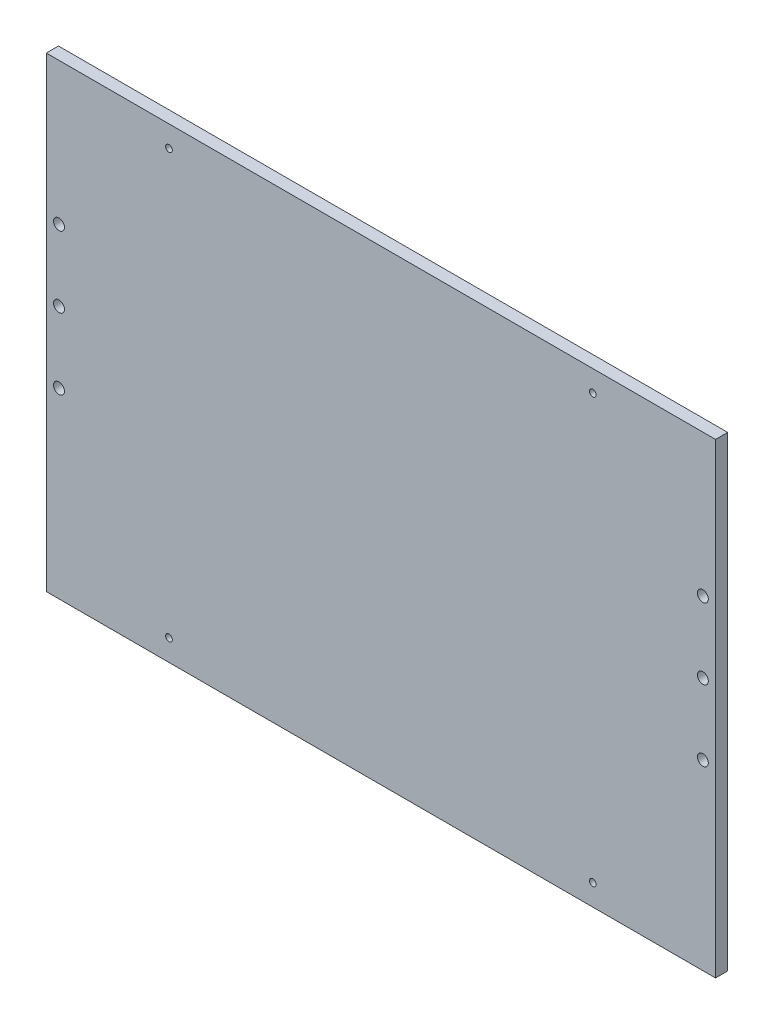
ISO-10303-21;
HEADER;
FILE_DESCRIPTION(('STEP AP214'),'2;1');
FILE_NAME('part.step','',(''),(''),'','','');
FILE_SCHEMA(('AUTOMOTIVE_DESIGN { 1 0 10303 214 1 1 1 1 }'));
ENDSEC;
DATA;
#1=APPLICATION_CONTEXT('core data for automotive mechanical design processes');
#2=APPLICATION_PROTOCOL_DEFINITION('international standard','automotive_design',2000,#1);
#3=PRODUCT_CONTEXT('',#1,'mechanical');
#4=PRODUCT('Part','Part','',(#3));
#5=PRODUCT_RELATED_PRODUCT_CATEGORY('part','',(#4));
#6=PRODUCT_DEFINITION_FORMATION('','',#4);
#7=PRODUCT_DEFINITION_CONTEXT('part definition',#1,'design');
#8=PRODUCT_DEFINITION('design','',#6,#7);
#9=PRODUCT_DEFINITION_SHAPE('','',#8);
#10=(LENGTH_UNIT() NAMED_UNIT(*) SI_UNIT(.MILLI.,.METRE.));
#11=(NAMED_UNIT(*) PLANE_ANGLE_UNIT() SI_UNIT($,.RADIAN.));
#12=(NAMED_UNIT(*) SI_UNIT($,.STERADIAN.) SOLID_ANGLE_UNIT());
#13=UNCERTAINTY_MEASURE_WITH_UNIT(LENGTH_MEASURE(1.E-05),#10,'distance_accuracy_value','');
#14=(GEOMETRIC_REPRESENTATION_CONTEXT(3) GLOBAL_UNCERTAINTY_ASSIGNED_CONTEXT((#13)) GLOBAL_UNIT_ASSIGNED_CONTEXT((#10,
#11,#12)) REPRESENTATION_CONTEXT('',''));
#15=CARTESIAN_POINT('',(0.,0.,0.));
#16=DIRECTION('',(0.,0.,1.));
#17=DIRECTION('',(1.,0.,0.));
#18=AXIS2_PLACEMENT_3D('',#15,#16,#17);
#19=CARTESIAN_POINT('',(-165.,-80.,72.));
#20=DIRECTION('',(-1.,0.,0.));
#21=DIRECTION('',(0.,-1.,0.));
#22=AXIS2_PLACEMENT_3D('',#19,#20,#21);
#23=PLANE('',#22);
#24=DIRECTION('',(0.,1.,0.));
#25=VECTOR('',#24,1.);
#26=CARTESIAN_POINT('',(-165.,-80.,66.));
#27=LINE('',#26,#25);
#28=CARTESIAN_POINT('',(-165.,-195.,66.));
#29=VERTEX_POINT('',#28);
#30=CARTESIAN_POINT('',(-165.,35.,66.));
#31=VERTEX_POINT('',#30);
#32=EDGE_CURVE('E104',#29,#31,#27,.T.);
#33=ORIENTED_EDGE('',*,*,#32,.F.);
#34=DIRECTION('',(0.,0.,-1.));
#35=VECTOR('',#34,1.);
#36=CARTESIAN_POINT('',(-165.,-195.,72.));
#37=LINE('',#36,#35);
#38=CARTESIAN_POINT('',(-165.,-195.,72.));
#39=VERTEX_POINT('',#38);
#40=EDGE_CURVE('E10',#39,#29,#37,.T.);
#41=ORIENTED_EDGE('',*,*,#40,.F.);
#42=DIRECTION('',(0.,1.,0.));
#43=VECTOR('',#42,1.);
#44=CARTESIAN_POINT('',(-165.,-80.,72.));
#45=LINE('',#44,#43);
#46=CARTESIAN_POINT('',(-165.,35.,72.));
#47=VERTEX_POINT('',#46);
#48=EDGE_CURVE('E81',#39,#47,#45,.T.);
#49=ORIENTED_EDGE('',*,*,#48,.T.);
#50=DIRECTION('',(0.,0.,-1.));
#51=VECTOR('',#50,1.);
#52=CARTESIAN_POINT('',(-165.,35.,72.));
#53=LINE('',#52,#51);
#54=EDGE_CURVE('E40',#47,#31,#53,.T.);
#55=ORIENTED_EDGE('',*,*,#54,.T.);
#56=EDGE_LOOP('',(#33,#41,#49,#55));
#57=FACE_BOUND('',#56,.T.);
#58=ADVANCED_FACE('F16',(#57),#23,.T.);
#59=CARTESIAN_POINT('',(0.,-195.,72.));
#60=DIRECTION('',(0.,1.,0.));
#61=DIRECTION('',(0.,0.,1.));
#62=AXIS2_PLACEMENT_3D('',#59,#60,#61);
#63=PLANE('',#62);
#64=DIRECTION('',(1.,0.,0.));
#65=VECTOR('',#64,1.);
#66=CARTESIAN_POINT('',(0.,-195.,66.));
#67=LINE('',#66,#65);
#68=CARTESIAN_POINT('',(165.,-195.,66.));
#69=VERTEX_POINT('',#68);
#70=EDGE_CURVE('E88',#29,#69,#67,.T.);
#71=ORIENTED_EDGE('',*,*,#70,.T.);
#72=DIRECTION('',(0.,0.,-1.));
#73=VECTOR('',#72,1.);
#74=CARTESIAN_POINT('',(165.,-195.,72.));
#75=LINE('',#74,#73);
#76=CARTESIAN_POINT('',(165.,-195.,72.));
#77=VERTEX_POINT('',#76);
#78=EDGE_CURVE('E26',#77,#69,#75,.T.);
#79=ORIENTED_EDGE('',*,*,#78,.F.);
#80=DIRECTION('',(1.,0.,0.));
#81=VECTOR('',#80,1.);
#82=CARTESIAN_POINT('',(0.,-195.,72.));
#83=LINE('',#82,#81);
#84=EDGE_CURVE('E75',#39,#77,#83,.T.);
#85=ORIENTED_EDGE('',*,*,#84,.F.);
#86=ORIENTED_EDGE('',*,*,#40,.T.);
#87=EDGE_LOOP('',(#71,#79,#85,#86));
#88=FACE_BOUND('',#87,.T.);
#89=ADVANCED_FACE('F86',(#88),#63,.F.);
#90=CARTESIAN_POINT('',(165.,-80.,72.));
#91=DIRECTION('',(-1.,0.,0.));
#92=DIRECTION('',(0.,-1.,0.));
#93=AXIS2_PLACEMENT_3D('',#90,#91,#92);
#94=PLANE('',#93);
#95=DIRECTION('',(0.,1.,0.));
#96=VECTOR('',#95,1.);
#97=CARTESIAN_POINT('',(165.,-80.,66.));
#98=LINE('',#97,#96);
#99=CARTESIAN_POINT('',(165.,35.,66.));
#100=VERTEX_POINT('',#99);
#101=EDGE_CURVE('E109',#69,#100,#98,.T.);
#102=ORIENTED_EDGE('',*,*,#101,.T.);
#103=DIRECTION('',(0.,0.,-1.));
#104=VECTOR('',#103,1.);
#105=CARTESIAN_POINT('',(165.,35.,72.));
#106=LINE('',#105,#104);
#107=CARTESIAN_POINT('',(165.,35.,72.));
#108=VERTEX_POINT('',#107);
#109=EDGE_CURVE('E58',#108,#100,#106,.T.);
#110=ORIENTED_EDGE('',*,*,#109,.F.);
#111=DIRECTION('',(0.,1.,0.));
#112=VECTOR('',#111,1.);
#113=CARTESIAN_POINT('',(165.,-80.,72.));
#114=LINE('',#113,#112);
#115=EDGE_CURVE('E80',#77,#108,#114,.T.);
#116=ORIENTED_EDGE('',*,*,#115,.F.);
#117=ORIENTED_EDGE('',*,*,#78,.T.);
#118=EDGE_LOOP('',(#102,#110,#116,#117));
#119=FACE_BOUND('',#118,.T.);
#120=ADVANCED_FACE('F93',(#119),#94,.F.);
#121=CARTESIAN_POINT('',(0.,35.,72.));
#122=DIRECTION('',(0.,1.,0.));
#123=DIRECTION('',(0.,0.,1.));
#124=AXIS2_PLACEMENT_3D('',#121,#122,#123);
#125=PLANE('',#124);
#126=DIRECTION('',(1.,0.,0.));
#127=VECTOR('',#126,1.);
#128=CARTESIAN_POINT('',(0.,35.,66.));
#129=LINE('',#128,#127);
#130=EDGE_CURVE('E111',#31,#100,#129,.T.);
#131=ORIENTED_EDGE('',*,*,#130,.F.);
#132=ORIENTED_EDGE('',*,*,#54,.F.);
#133=DIRECTION('',(1.,0.,0.));
#134=VECTOR('',#133,1.);
#135=CARTESIAN_POINT('',(0.,35.,72.));
#136=LINE('',#135,#134);
#137=EDGE_CURVE('E95',#47,#108,#136,.T.);
#138=ORIENTED_EDGE('',*,*,#137,.T.);
#139=ORIENTED_EDGE('',*,*,#109,.T.);
#140=EDGE_LOOP('',(#131,#132,#138,#139));
#141=FACE_BOUND('',#140,.T.);
#142=ADVANCED_FACE('F160',(#141),#125,.T.);
#143=CARTESIAN_POINT('',(0.,-80.,72.));
#144=DIRECTION('',(0.,0.,1.));
#145=DIRECTION('',(1.,0.,0.));
#146=AXIS2_PLACEMENT_3D('',#143,#144,#145);
#147=PLANE('',#146);
#148=CARTESIAN_POINT('',(104.5,24.5,72.));
#149=DIRECTION('',(0.,0.,1.));
#150=DIRECTION('',(1.,0.,0.));
#151=AXIS2_PLACEMENT_3D('',#148,#149,#150);
#152=CIRCLE('',#151,1.65);
#153=CARTESIAN_POINT('',(106.15,24.5,72.));
#154=VERTEX_POINT('',#153);
#155=EDGE_CURVE('E219',#154,#154,#152,.T.);
#156=ORIENTED_EDGE('',*,*,#155,.F.);
#157=EDGE_LOOP('',(#156));
#158=FACE_BOUND('',#157,.T.);
#159=CARTESIAN_POINT('',(-104.5,-184.5,72.));
#160=DIRECTION('',(0.,0.,1.));
#161=DIRECTION('',(1.,0.,0.));
#162=AXIS2_PLACEMENT_3D('',#159,#160,#161);
#163=CIRCLE('',#162,1.65);
#164=CARTESIAN_POINT('',(-102.85,-184.5,72.));
#165=VERTEX_POINT('',#164);
#166=EDGE_CURVE('E237',#165,#165,#163,.T.);
#167=ORIENTED_EDGE('',*,*,#166,.F.);
#168=EDGE_LOOP('',(#167));
#169=FACE_BOUND('',#168,.T.);
#170=CARTESIAN_POINT('',(104.5,-184.5,72.));
#171=DIRECTION('',(0.,0.,1.));
#172=DIRECTION('',(1.,0.,0.));
#173=AXIS2_PLACEMENT_3D('',#170,#171,#172);
#174=CIRCLE('',#173,1.65);
#175=CARTESIAN_POINT('',(106.15,-184.5,72.));
#176=VERTEX_POINT('',#175);
#177=EDGE_CURVE('E241',#176,#176,#174,.T.);
#178=ORIENTED_EDGE('',*,*,#177,.F.);
#179=EDGE_LOOP('',(#178));
#180=FACE_BOUND('',#179,.T.);
#181=CARTESIAN_POINT('',(-104.5,24.5,72.));
#182=DIRECTION('',(0.,0.,1.));
#183=DIRECTION('',(1.,0.,0.));
#184=AXIS2_PLACEMENT_3D('',#181,#182,#183);
#185=CIRCLE('',#184,1.65);
#186=CARTESIAN_POINT('',(-102.85,24.5,72.));
#187=VERTEX_POINT('',#186);
#188=EDGE_CURVE('E245',#187,#187,#185,.T.);
#189=ORIENTED_EDGE('',*,*,#188,.F.);
#190=EDGE_LOOP('',(#189));
#191=FACE_BOUND('',#190,.T.);
#192=CARTESIAN_POINT('',(158.75,-105.,72.));
#193=DIRECTION('',(0.,0.,-1.));
#194=DIRECTION('',(1.,0.,0.));
#195=AXIS2_PLACEMENT_3D('',#192,#193,#194);
#196=CIRCLE('',#195,2.7);
#197=CARTESIAN_POINT('',(161.45,-105.,72.));
#198=VERTEX_POINT('',#197);
#199=EDGE_CURVE('E186',#198,#198,#196,.T.);
#200=ORIENTED_EDGE('',*,*,#199,.T.);
#201=EDGE_LOOP('',(#200));
#202=FACE_BOUND('',#201,.T.);
#203=CARTESIAN_POINT('',(158.75,-70.,72.));
#204=DIRECTION('',(0.,0.,-1.));
#205=DIRECTION('',(1.,0.,0.));
#206=AXIS2_PLACEMENT_3D('',#203,#204,#205);
#207=CIRCLE('',#206,2.7);
#208=CARTESIAN_POINT('',(161.45,-70.,72.));
#209=VERTEX_POINT('',#208);
#210=EDGE_CURVE('E227',#209,#209,#207,.T.);
#211=ORIENTED_EDGE('',*,*,#210,.T.);
#212=EDGE_LOOP('',(#211));
#213=FACE_BOUND('',#212,.T.);
#214=CARTESIAN_POINT('',(158.75,-35.,72.));
#215=DIRECTION('',(0.,0.,-1.));
#216=DIRECTION('',(1.,0.,0.));
#217=AXIS2_PLACEMENT_3D('',#214,#215,#216);
#218=CIRCLE('',#217,2.7);
#219=CARTESIAN_POINT('',(161.45,-35.,72.));
#220=VERTEX_POINT('',#219);
#221=EDGE_CURVE('E218',#220,#220,#218,.T.);
#222=ORIENTED_EDGE('',*,*,#221,.T.);
#223=EDGE_LOOP('',(#222));
#224=FACE_BOUND('',#223,.T.);
#225=CARTESIAN_POINT('',(-158.75,-35.,72.));
#226=DIRECTION('',(0.,0.,1.));
#227=DIRECTION('',(1.,0.,0.));
#228=AXIS2_PLACEMENT_3D('',#225,#226,#227);
#229=CIRCLE('',#228,2.7);
#230=CARTESIAN_POINT('',(-156.05,-35.,72.));
#231=VERTEX_POINT('',#230);
#232=EDGE_CURVE('E123',#231,#231,#229,.T.);
#233=ORIENTED_EDGE('',*,*,#232,.F.);
#234=EDGE_LOOP('',(#233));
#235=FACE_BOUND('',#234,.T.);
#236=CARTESIAN_POINT('',(-158.75,-70.,72.));
#237=DIRECTION('',(0.,0.,1.));
#238=DIRECTION('',(1.,0.,0.));
#239=AXIS2_PLACEMENT_3D('',#236,#237,#238);
#240=CIRCLE('',#239,2.7);
#241=CARTESIAN_POINT('',(-156.05,-70.,72.));
#242=VERTEX_POINT('',#241);
#243=EDGE_CURVE('E185',#242,#242,#240,.T.);
#244=ORIENTED_EDGE('',*,*,#243,.F.);
#245=EDGE_LOOP('',(#244));
#246=FACE_BOUND('',#245,.T.);
#247=CARTESIAN_POINT('',(-158.75,-105.,72.));
#248=DIRECTION('',(0.,0.,1.));
#249=DIRECTION('',(1.,0.,0.));
#250=AXIS2_PLACEMENT_3D('',#247,#248,#249);
#251=CIRCLE('',#250,2.7);
#252=CARTESIAN_POINT('',(-156.05,-105.,72.));
#253=VERTEX_POINT('',#252);
#254=EDGE_CURVE('E180',#253,#253,#251,.T.);
#255=ORIENTED_EDGE('',*,*,#254,.F.);
#256=EDGE_LOOP('',(#255));
#257=FACE_BOUND('',#256,.T.);
#258=ORIENTED_EDGE('',*,*,#48,.F.);
#259=ORIENTED_EDGE('',*,*,#84,.T.);
#260=ORIENTED_EDGE('',*,*,#115,.T.);
#261=ORIENTED_EDGE('',*,*,#137,.F.);
#262=EDGE_LOOP('',(#258,#259,#260,#261));
#263=FACE_BOUND('',#262,.T.);
#264=ADVANCED_FACE('F77',(#158,#169,#180,#191,#202,#213,#224,#235,#246,#257,#263),#147,.T.);
#265=CARTESIAN_POINT('',(0.,-80.,66.));
#266=DIRECTION('',(0.,0.,1.));
#267=DIRECTION('',(1.,0.,0.));
#268=AXIS2_PLACEMENT_3D('',#265,#266,#267);
#269=PLANE('',#268);
#270=CARTESIAN_POINT('',(104.5,24.5,66.));
#271=DIRECTION('',(0.,0.,1.));
#272=DIRECTION('',(1.,0.,0.));
#273=AXIS2_PLACEMENT_3D('',#270,#271,#272);
#274=CIRCLE('',#273,1.65);
#275=CARTESIAN_POINT('',(106.15,24.5,66.));
#276=VERTEX_POINT('',#275);
#277=EDGE_CURVE('E253',#276,#276,#274,.F.);
#278=ORIENTED_EDGE('',*,*,#277,.F.);
#279=EDGE_LOOP('',(#278));
#280=FACE_BOUND('',#279,.T.);
#281=CARTESIAN_POINT('',(-104.5,-184.5,66.));
#282=DIRECTION('',(0.,0.,1.));
#283=DIRECTION('',(1.,0.,0.));
#284=AXIS2_PLACEMENT_3D('',#281,#282,#283);
#285=CIRCLE('',#284,1.65);
#286=CARTESIAN_POINT('',(-102.85,-184.5,66.));
#287=VERTEX_POINT('',#286);
#288=EDGE_CURVE('E254',#287,#287,#285,.F.);
#289=ORIENTED_EDGE('',*,*,#288,.F.);
#290=EDGE_LOOP('',(#289));
#291=FACE_BOUND('',#290,.T.);
#292=CARTESIAN_POINT('',(104.5,-184.5,66.));
#293=DIRECTION('',(0.,0.,1.));
#294=DIRECTION('',(1.,0.,0.));
#295=AXIS2_PLACEMENT_3D('',#292,#293,#294);
#296=CIRCLE('',#295,1.65);
#297=CARTESIAN_POINT('',(106.15,-184.5,66.));
#298=VERTEX_POINT('',#297);
#299=EDGE_CURVE('E258',#298,#298,#296,.F.);
#300=ORIENTED_EDGE('',*,*,#299,.F.);
#301=EDGE_LOOP('',(#300));
#302=FACE_BOUND('',#301,.T.);
#303=CARTESIAN_POINT('',(-104.5,24.5,66.));
#304=DIRECTION('',(0.,0.,1.));
#305=DIRECTION('',(1.,0.,0.));
#306=AXIS2_PLACEMENT_3D('',#303,#304,#305);
#307=CIRCLE('',#306,1.65);
#308=CARTESIAN_POINT('',(-102.85,24.5,66.));
#309=VERTEX_POINT('',#308);
#310=EDGE_CURVE('E249',#309,#309,#307,.F.);
#311=ORIENTED_EDGE('',*,*,#310,.F.);
#312=EDGE_LOOP('',(#311));
#313=FACE_BOUND('',#312,.T.);
#314=CARTESIAN_POINT('',(158.75,-105.,66.));
#315=DIRECTION('',(0.,0.,1.));
#316=DIRECTION('',(1.,0.,0.));
#317=AXIS2_PLACEMENT_3D('',#314,#315,#316);
#318=CIRCLE('',#317,2.7);
#319=CARTESIAN_POINT('',(161.45,-105.,66.));
#320=VERTEX_POINT('',#319);
#321=EDGE_CURVE('E194',#320,#320,#318,.T.);
#322=ORIENTED_EDGE('',*,*,#321,.T.);
#323=EDGE_LOOP('',(#322));
#324=FACE_BOUND('',#323,.T.);
#325=CARTESIAN_POINT('',(158.75,-70.,66.));
#326=DIRECTION('',(0.,0.,1.));
#327=DIRECTION('',(1.,0.,0.));
#328=AXIS2_PLACEMENT_3D('',#325,#326,#327);
#329=CIRCLE('',#328,2.7);
#330=CARTESIAN_POINT('',(161.45,-70.,66.));
#331=VERTEX_POINT('',#330);
#332=EDGE_CURVE('E223',#331,#331,#329,.T.);
#333=ORIENTED_EDGE('',*,*,#332,.T.);
#334=EDGE_LOOP('',(#333));
#335=FACE_BOUND('',#334,.T.);
#336=CARTESIAN_POINT('',(158.75,-35.,66.));
#337=DIRECTION('',(0.,0.,1.));
#338=DIRECTION('',(1.,0.,0.));
#339=AXIS2_PLACEMENT_3D('',#336,#337,#338);
#340=CIRCLE('',#339,2.7);
#341=CARTESIAN_POINT('',(161.45,-35.,66.));
#342=VERTEX_POINT('',#341);
#343=EDGE_CURVE('E214',#342,#342,#340,.T.);
#344=ORIENTED_EDGE('',*,*,#343,.T.);
#345=EDGE_LOOP('',(#344));
#346=FACE_BOUND('',#345,.T.);
#347=CARTESIAN_POINT('',(-158.75,-35.,66.));
#348=DIRECTION('',(0.,0.,1.));
#349=DIRECTION('',(1.,0.,0.));
#350=AXIS2_PLACEMENT_3D('',#347,#348,#349);
#351=CIRCLE('',#350,2.7);
#352=CARTESIAN_POINT('',(-156.05,-35.,66.));
#353=VERTEX_POINT('',#352);
#354=EDGE_CURVE('E19',#353,#353,#351,.T.);
#355=ORIENTED_EDGE('',*,*,#354,.T.);
#356=EDGE_LOOP('',(#355));
#357=FACE_BOUND('',#356,.T.);
#358=CARTESIAN_POINT('',(-158.75,-70.,66.));
#359=DIRECTION('',(0.,0.,1.));
#360=DIRECTION('',(1.,0.,0.));
#361=AXIS2_PLACEMENT_3D('',#358,#359,#360);
#362=CIRCLE('',#361,2.7);
#363=CARTESIAN_POINT('',(-156.05,-70.,66.));
#364=VERTEX_POINT('',#363);
#365=EDGE_CURVE('E122',#364,#364,#362,.T.);
#366=ORIENTED_EDGE('',*,*,#365,.T.);
#367=EDGE_LOOP('',(#366));
#368=FACE_BOUND('',#367,.T.);
#369=CARTESIAN_POINT('',(-158.75,-105.,66.));
#370=DIRECTION('',(0.,0.,1.));
#371=DIRECTION('',(1.,0.,0.));
#372=AXIS2_PLACEMENT_3D('',#369,#370,#371);
#373=CIRCLE('',#372,2.7);
#374=CARTESIAN_POINT('',(-156.05,-105.,66.));
#375=VERTEX_POINT('',#374);
#376=EDGE_CURVE('E119',#375,#375,#373,.T.);
#377=ORIENTED_EDGE('',*,*,#376,.T.);
#378=EDGE_LOOP('',(#377));
#379=FACE_BOUND('',#378,.T.);
#380=ORIENTED_EDGE('',*,*,#32,.T.);
#381=ORIENTED_EDGE('',*,*,#130,.T.);
#382=ORIENTED_EDGE('',*,*,#101,.F.);
#383=ORIENTED_EDGE('',*,*,#70,.F.);
#384=EDGE_LOOP('',(#380,#381,#382,#383));
#385=FACE_BOUND('',#384,.T.);
#386=ADVANCED_FACE('F135',(#280,#291,#302,#313,#324,#335,#346,#357,#368,#379,#385),#269,.F.);
#387=CARTESIAN_POINT('',(-158.75,-105.,51.));
#388=DIRECTION('',(0.,0.,1.));
#389=DIRECTION('',(1.,0.,0.));
#390=AXIS2_PLACEMENT_3D('',#387,#388,#389);
#391=CYLINDRICAL_SURFACE('',#390,2.7);
#392=ORIENTED_EDGE('',*,*,#254,.T.);
#393=EDGE_LOOP('',(#392));
#394=FACE_BOUND('',#393,.T.);
#395=ORIENTED_EDGE('',*,*,#376,.F.);
#396=EDGE_LOOP('',(#395));
#397=FACE_BOUND('',#396,.T.);
#398=ADVANCED_FACE('F151',(#394,#397),#391,.F.);
#399=CARTESIAN_POINT('',(-158.75,-70.,51.));
#400=DIRECTION('',(0.,0.,1.));
#401=DIRECTION('',(1.,0.,0.));
#402=AXIS2_PLACEMENT_3D('',#399,#400,#401);
#403=CYLINDRICAL_SURFACE('',#402,2.7);
#404=ORIENTED_EDGE('',*,*,#243,.T.);
#405=EDGE_LOOP('',(#404));
#406=FACE_BOUND('',#405,.T.);
#407=ORIENTED_EDGE('',*,*,#365,.F.);
#408=EDGE_LOOP('',(#407));
#409=FACE_BOUND('',#408,.T.);
#410=ADVANCED_FACE('F140',(#406,#409),#403,.F.);
#411=CARTESIAN_POINT('',(-158.75,-35.,51.));
#412=DIRECTION('',(0.,0.,1.));
#413=DIRECTION('',(1.,0.,0.));
#414=AXIS2_PLACEMENT_3D('',#411,#412,#413);
#415=CYLINDRICAL_SURFACE('',#414,2.7);
#416=ORIENTED_EDGE('',*,*,#232,.T.);
#417=EDGE_LOOP('',(#416));
#418=FACE_BOUND('',#417,.T.);
#419=ORIENTED_EDGE('',*,*,#354,.F.);
#420=EDGE_LOOP('',(#419));
#421=FACE_BOUND('',#420,.T.);
#422=ADVANCED_FACE('F137',(#418,#421),#415,.F.);
#423=CARTESIAN_POINT('',(158.75,-35.,65.998));
#424=DIRECTION('',(0.,0.,1.));
#425=DIRECTION('',(1.,0.,0.));
#426=AXIS2_PLACEMENT_3D('',#423,#424,#425);
#427=CYLINDRICAL_SURFACE('',#426,2.7);
#428=ORIENTED_EDGE('',*,*,#343,.F.);
#429=EDGE_LOOP('',(#428));
#430=FACE_BOUND('',#429,.T.);
#431=ORIENTED_EDGE('',*,*,#221,.F.);
#432=EDGE_LOOP('',(#431));
#433=FACE_BOUND('',#432,.T.);
#434=ADVANCED_FACE('F139',(#430,#433),#427,.F.);
#435=CARTESIAN_POINT('',(158.75,-70.,65.998));
#436=DIRECTION('',(0.,0.,1.));
#437=DIRECTION('',(1.,0.,0.));
#438=AXIS2_PLACEMENT_3D('',#435,#436,#437);
#439=CYLINDRICAL_SURFACE('',#438,2.7);
#440=ORIENTED_EDGE('',*,*,#332,.F.);
#441=EDGE_LOOP('',(#440));
#442=FACE_BOUND('',#441,.T.);
#443=ORIENTED_EDGE('',*,*,#210,.F.);
#444=EDGE_LOOP('',(#443));
#445=FACE_BOUND('',#444,.T.);
#446=ADVANCED_FACE('F148',(#442,#445),#439,.F.);
#447=CARTESIAN_POINT('',(158.75,-105.,65.998));
#448=DIRECTION('',(0.,0.,1.));
#449=DIRECTION('',(1.,0.,0.));
#450=AXIS2_PLACEMENT_3D('',#447,#448,#449);
#451=CYLINDRICAL_SURFACE('',#450,2.7);
#452=ORIENTED_EDGE('',*,*,#321,.F.);
#453=EDGE_LOOP('',(#452));
#454=FACE_BOUND('',#453,.T.);
#455=ORIENTED_EDGE('',*,*,#199,.F.);
#456=EDGE_LOOP('',(#455));
#457=FACE_BOUND('',#456,.T.);
#458=ADVANCED_FACE('F288',(#454,#457),#451,.F.);
#459=CARTESIAN_POINT('',(-104.5,24.5,65.998));
#460=DIRECTION('',(0.,0.,1.));
#461=DIRECTION('',(1.,0.,0.));
#462=AXIS2_PLACEMENT_3D('',#459,#460,#461);
#463=CYLINDRICAL_SURFACE('',#462,1.65);
#464=ORIENTED_EDGE('',*,*,#188,.T.);
#465=EDGE_LOOP('',(#464));
#466=FACE_BOUND('',#465,.T.);
#467=ORIENTED_EDGE('',*,*,#310,.T.);
#468=EDGE_LOOP('',(#467));
#469=FACE_BOUND('',#468,.T.);
#470=ADVANCED_FACE('F295',(#466,#469),#463,.F.);
#471=CARTESIAN_POINT('',(104.5,-184.5,65.998));
#472=DIRECTION('',(0.,0.,1.));
#473=DIRECTION('',(1.,0.,0.));
#474=AXIS2_PLACEMENT_3D('',#471,#472,#473);
#475=CYLINDRICAL_SURFACE('',#474,1.65);
#476=ORIENTED_EDGE('',*,*,#177,.T.);
#477=EDGE_LOOP('',(#476));
#478=FACE_BOUND('',#477,.T.);
#479=ORIENTED_EDGE('',*,*,#299,.T.);
#480=EDGE_LOOP('',(#479));
#481=FACE_BOUND('',#480,.T.);
#482=ADVANCED_FACE('F267',(#478,#481),#475,.F.);
#483=CARTESIAN_POINT('',(-104.5,-184.5,65.998));
#484=DIRECTION('',(0.,0.,1.));
#485=DIRECTION('',(1.,0.,0.));
#486=AXIS2_PLACEMENT_3D('',#483,#484,#485);
#487=CYLINDRICAL_SURFACE('',#486,1.65);
#488=ORIENTED_EDGE('',*,*,#166,.T.);
#489=EDGE_LOOP('',(#488));
#490=FACE_BOUND('',#489,.T.);
#491=ORIENTED_EDGE('',*,*,#288,.T.);
#492=EDGE_LOOP('',(#491));
#493=FACE_BOUND('',#492,.T.);
#494=ADVANCED_FACE('F302',(#490,#493),#487,.F.);
#495=CARTESIAN_POINT('',(104.5,24.5,65.998));
#496=DIRECTION('',(0.,0.,1.));
#497=DIRECTION('',(1.,0.,0.));
#498=AXIS2_PLACEMENT_3D('',#495,#496,#497);
#499=CYLINDRICAL_SURFACE('',#498,1.65);
#500=ORIENTED_EDGE('',*,*,#155,.T.);
#501=EDGE_LOOP('',(#500));
#502=FACE_BOUND('',#501,.T.);
#503=ORIENTED_EDGE('',*,*,#277,.T.);
#504=EDGE_LOOP('',(#503));
#505=FACE_BOUND('',#504,.T.);
#506=ADVANCED_FACE('F305',(#502,#505),#499,.F.);
#507=CLOSED_SHELL('',(#58,#89,#120,#142,#264,#386,#398,#410,#422,#434,#446,#458,#470,#482,#494,#506));
#508=MANIFOLD_SOLID_BREP('B1',#507);
#509=ADVANCED_BREP_SHAPE_REPRESENTATION('',(#18,#508),#14);
#510=SHAPE_DEFINITION_REPRESENTATION(#9,#509);
ENDSEC;
END-ISO-10303-21;
